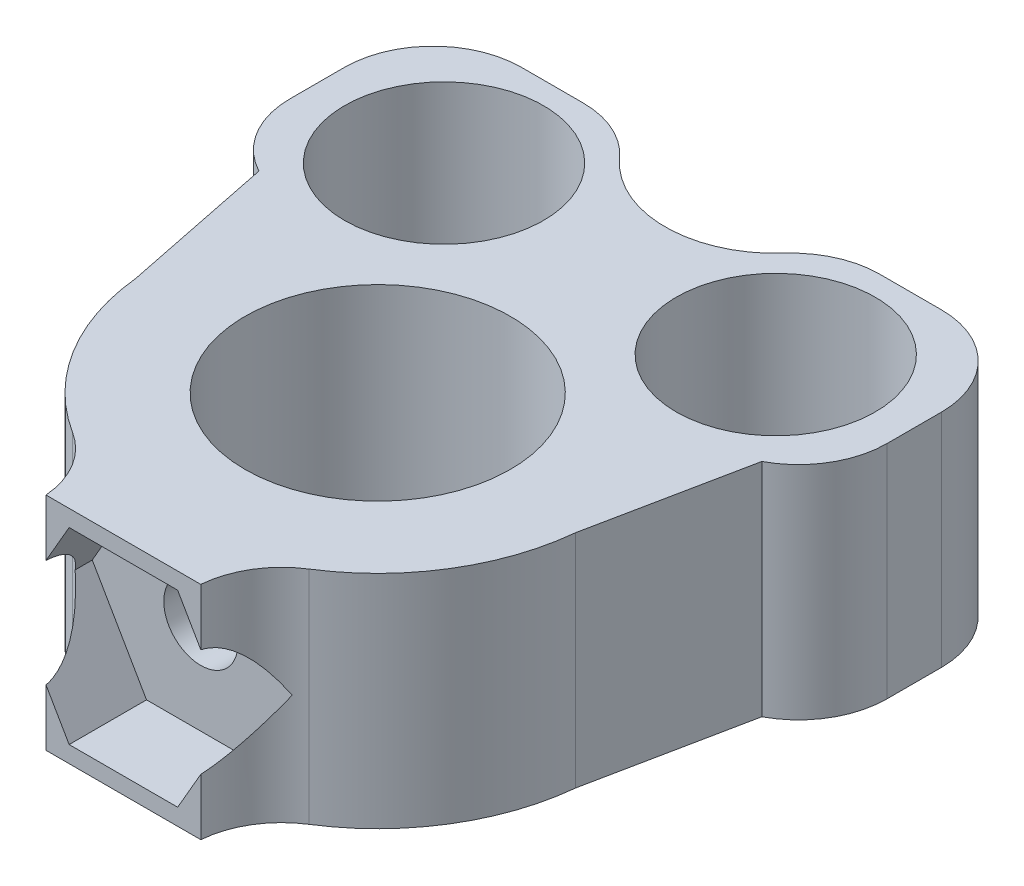
ISO-10303-21;
HEADER;
FILE_DESCRIPTION(('STEP AP214'),'2;1');
FILE_NAME('part.step','',(''),(''),'','','');
FILE_SCHEMA(('AUTOMOTIVE_DESIGN { 1 0 10303 214 1 1 1 1 }'));
ENDSEC;
DATA;
#1=APPLICATION_CONTEXT('core data for automotive mechanical design processes');
#2=APPLICATION_PROTOCOL_DEFINITION('international standard','automotive_design',2000,#1);
#3=PRODUCT_CONTEXT('',#1,'mechanical');
#4=PRODUCT('Part','Part','',(#3));
#5=PRODUCT_RELATED_PRODUCT_CATEGORY('part','',(#4));
#6=PRODUCT_DEFINITION_FORMATION('','',#4);
#7=PRODUCT_DEFINITION_CONTEXT('part definition',#1,'design');
#8=PRODUCT_DEFINITION('design','',#6,#7);
#9=PRODUCT_DEFINITION_SHAPE('','',#8);
#10=(LENGTH_UNIT() NAMED_UNIT(*) SI_UNIT(.MILLI.,.METRE.));
#11=(NAMED_UNIT(*) PLANE_ANGLE_UNIT() SI_UNIT($,.RADIAN.));
#12=(NAMED_UNIT(*) SI_UNIT($,.STERADIAN.) SOLID_ANGLE_UNIT());
#13=UNCERTAINTY_MEASURE_WITH_UNIT(LENGTH_MEASURE(1.E-05),#10,'distance_accuracy_value','');
#14=(GEOMETRIC_REPRESENTATION_CONTEXT(3) GLOBAL_UNCERTAINTY_ASSIGNED_CONTEXT((#13)) GLOBAL_UNIT_ASSIGNED_CONTEXT((#10,
#11,#12)) REPRESENTATION_CONTEXT('',''));
#15=CARTESIAN_POINT('',(0.,0.,0.));
#16=DIRECTION('',(0.,0.,1.));
#17=DIRECTION('',(1.,0.,0.));
#18=AXIS2_PLACEMENT_3D('',#15,#16,#17);
#19=CARTESIAN_POINT('',(-3.5,17.6157731058639,11.5));
#20=DIRECTION('',(0.,0.,-1.));
#21=DIRECTION('',(-1.,0.,0.));
#22=AXIS2_PLACEMENT_3D('',#19,#20,#21);
#23=PLANE('',#22);
#24=DIRECTION('',(0.,-1.,0.));
#25=VECTOR('',#24,1.);
#26=CARTESIAN_POINT('',(3.5,17.6157731058639,11.5));
#27=LINE('',#26,#25);
#28=CARTESIAN_POINT('',(3.5,2.56217782649107,11.5));
#29=VERTEX_POINT('',#28);
#30=CARTESIAN_POINT('',(3.5,0.,11.5));
#31=VERTEX_POINT('',#30);
#32=EDGE_CURVE('E276',#29,#31,#27,.T.);
#33=ORIENTED_EDGE('',*,*,#32,.F.);
#34=DIRECTION('',(0.5,0.866025403784439,0.));
#35=VECTOR('',#34,1.);
#36=CARTESIAN_POINT('',(2.45373864405591,0.749999999999999,11.5));
#37=LINE('',#36,#35);
#38=CARTESIAN_POINT('',(2.45373864405591,0.749999999999999,11.5));
#39=VERTEX_POINT('',#38);
#40=EDGE_CURVE('E248',#39,#29,#37,.T.);
#41=ORIENTED_EDGE('',*,*,#40,.F.);
#42=DIRECTION('',(1.,0.,0.));
#43=VECTOR('',#42,1.);
#44=CARTESIAN_POINT('',(-2.45373864405591,0.75,11.5));
#45=LINE('',#44,#43);
#46=CARTESIAN_POINT('',(-2.45373864405591,0.75,11.5));
#47=VERTEX_POINT('',#46);
#48=EDGE_CURVE('E235',#47,#39,#45,.T.);
#49=ORIENTED_EDGE('',*,*,#48,.F.);
#50=DIRECTION('',(0.5,-0.866025403784439,0.));
#51=VECTOR('',#50,1.);
#52=CARTESIAN_POINT('',(-4.90747728811182,5.,11.5));
#53=LINE('',#52,#51);
#54=CARTESIAN_POINT('',(-3.5,2.56217782649107,11.5));
#55=VERTEX_POINT('',#54);
#56=EDGE_CURVE('E238',#55,#47,#53,.T.);
#57=ORIENTED_EDGE('',*,*,#56,.F.);
#58=DIRECTION('',(0.,-1.,0.));
#59=VECTOR('',#58,1.);
#60=CARTESIAN_POINT('',(-3.5,17.6157731058639,11.5));
#61=LINE('',#60,#59);
#62=CARTESIAN_POINT('',(-3.5,0.,11.5));
#63=VERTEX_POINT('',#62);
#64=EDGE_CURVE('E355',#55,#63,#61,.T.);
#65=ORIENTED_EDGE('',*,*,#64,.T.);
#66=DIRECTION('',(1.,0.,0.));
#67=VECTOR('',#66,1.);
#68=CARTESIAN_POINT('',(-3.5,0.,11.5));
#69=LINE('',#68,#67);
#70=EDGE_CURVE('E277',#63,#31,#69,.T.);
#71=ORIENTED_EDGE('',*,*,#70,.T.);
#72=EDGE_LOOP('',(#33,#41,#49,#57,#65,#71));
#73=FACE_BOUND('',#72,.T.);
#74=ADVANCED_FACE('F37',(#73),#23,.F.);
#75=CARTESIAN_POINT('',(0.,5.,1.5));
#76=DIRECTION('',(0.,0.,1.));
#77=DIRECTION('',(1.,0.,0.));
#78=AXIS2_PLACEMENT_3D('',#75,#76,#77);
#79=CYLINDRICAL_SURFACE('',#78,1.675);
#80=CARTESIAN_POINT('',(1.675,5.,5.76145597917749));
#81=CARTESIAN_POINT('',(1.67499813287039,4.90790372306215,5.76145739046166));
#82=CARTESIAN_POINT('',(1.66737855764244,4.81578829290095,5.76368835662663));
#83=CARTESIAN_POINT('',(1.63716675301543,4.63422962014335,5.77234130192067));
#84=CARTESIAN_POINT('',(1.6145679402135,4.54478757057462,5.77876512379866));
#85=CARTESIAN_POINT('',(1.55520802415418,4.37122887277344,5.79502078922855));
#86=CARTESIAN_POINT('',(1.51846813881969,4.28710446482321,5.80484752468551));
#87=CARTESIAN_POINT('',(1.43193673503308,4.12619736566288,5.82679514004935));
#88=CARTESIAN_POINT('',(1.38214385190091,4.04941544324975,5.83891625979534));
#89=CARTESIAN_POINT('',(1.26945999140456,3.90326872173409,5.86445926362132));
#90=CARTESIAN_POINT('',(1.20627494913284,3.83413494000583,5.87790594225534));
#91=CARTESIAN_POINT('',(1.06923199775077,3.70729471628609,5.90437177192418));
#92=CARTESIAN_POINT('',(0.995372892153938,3.64958955708298,5.91739087482976));
#93=CARTESIAN_POINT('',(0.837461437101782,3.5462669106183,5.9418131423305));
#94=CARTESIAN_POINT('',(0.753251929263998,3.50088122484796,5.95318365968228));
#95=CARTESIAN_POINT('',(0.578026161618626,3.42500123569182,5.97274182438189));
#96=CARTESIAN_POINT('',(0.487011168007824,3.39450417010972,5.98093006206144));
#97=CARTESIAN_POINT('',(0.303171467813839,3.35002088286354,5.99302571511142));
#98=CARTESIAN_POINT('',(0.210448789463982,3.3356411839928,5.99703497314064));
#99=CARTESIAN_POINT('',(0.0238261874268686,3.32256061197843,6.00067794381072));
#100=CARTESIAN_POINT('',(-0.0700735179249902,3.32385687275306,6.00031245629929));
#101=CARTESIAN_POINT('',(-0.25363814483196,3.34181902168141,5.99532078768024));
#102=CARTESIAN_POINT('',(-0.343348400806763,3.35805945132849,5.99081255480385));
#103=CARTESIAN_POINT('',(-0.518715700520692,3.40475882911559,5.97818261967571));
#104=CARTESIAN_POINT('',(-0.604372502372109,3.43521862461322,5.97006070207935));
#105=CARTESIAN_POINT('',(-0.77026029118548,3.50980418461912,5.95094536294966));
#106=CARTESIAN_POINT('',(-0.850424165784499,3.55407133977516,5.93992242562329));
#107=CARTESIAN_POINT('',(-1.00232760711901,3.65490539453904,5.91618616332203));
#108=CARTESIAN_POINT('',(-1.07406539309102,3.71147488693652,5.90347248223275));
#109=CARTESIAN_POINT('',(-1.20962033134318,3.83754801286481,5.87722296079586));
#110=CARTESIAN_POINT('',(-1.27309092189677,3.90742196677234,5.86367384774196));
#111=CARTESIAN_POINT('',(-1.38750286201445,4.05696001477119,5.83766114959023));
#112=CARTESIAN_POINT('',(-1.438443288192,4.13662482973296,5.82519764453789));
#113=CARTESIAN_POINT('',(-1.52664710801133,4.30429230674782,5.80271012915392));
#114=CARTESIAN_POINT('',(-1.56380767008233,4.39235172633889,5.79270464123621));
#115=CARTESIAN_POINT('',(-1.62267894505091,4.57381895759274,5.77649166082482));
#116=CARTESIAN_POINT('',(-1.64439391718776,4.66722528712178,5.77028312135989));
#117=CARTESIAN_POINT('',(-1.671142119666,4.85347269347323,5.76259253501128));
#118=CARTESIAN_POINT('',(-1.67669590311014,4.94623299917178,5.76096305754204));
#119=CARTESIAN_POINT('',(-1.67240539939881,5.13135866287216,5.76221013673988));
#120=CARTESIAN_POINT('',(-1.66256293229457,5.2237240662627,5.76508616079399));
#121=CARTESIAN_POINT('',(-1.62822002807531,5.40337347250912,5.77487692451402));
#122=CARTESIAN_POINT('',(-1.60404047022031,5.49072411605855,5.78170317578325));
#123=CARTESIAN_POINT('',(-1.54207458280703,5.66012777447521,5.79853689433599));
#124=CARTESIAN_POINT('',(-1.50428635362314,5.74218004785969,5.80854480572251));
#125=CARTESIAN_POINT('',(-1.41514442224651,5.90081372850195,5.83091071141389));
#126=CARTESIAN_POINT('',(-1.36348941563666,5.97721857023209,5.84331894507179));
#127=CARTESIAN_POINT('',(-1.2484479413425,6.12046664079486,5.8689730271058));
#128=CARTESIAN_POINT('',(-1.18505904931687,6.18730788862168,5.88221904820441));
#129=CARTESIAN_POINT('',(-1.04592689192099,6.31173397312628,5.90856998791621));
#130=CARTESIAN_POINT('',(-0.969852830365259,6.36895356112807,5.92165678361054));
#131=CARTESIAN_POINT('',(-0.808880746812239,6.46981498555978,5.94578215088506));
#132=CARTESIAN_POINT('',(-0.723983191871376,6.51345754017873,5.95682083079267));
#133=CARTESIAN_POINT('',(-0.548367966797927,6.58551375763772,5.97553531197357));
#134=CARTESIAN_POINT('',(-0.457700370905419,6.61404255627146,5.9832364540199));
#135=CARTESIAN_POINT('',(-0.272608408622516,6.65538385963051,5.99451997584414));
#136=CARTESIAN_POINT('',(-0.178184967105391,6.66820020909607,5.998103363198));
#137=CARTESIAN_POINT('',(0.00834005508443473,6.67749294405844,6.00069501379819));
#138=CARTESIAN_POINT('',(0.100413343589052,6.6745027516735,5.99985263886584));
#139=CARTESIAN_POINT('',(0.282693155894818,6.65351909472699,5.99403036082604));
#140=CARTESIAN_POINT('',(0.372899761944648,6.63552629265039,5.98905064041546));
#141=CARTESIAN_POINT('',(0.548179020904459,6.58536091296349,5.97554773415595));
#142=CARTESIAN_POINT('',(0.633287672861283,6.55330568520326,5.96705390596423));
#143=CARTESIAN_POINT('',(0.796966434661624,6.4760297516374,5.94740676969569));
#144=CARTESIAN_POINT('',(0.875535561234675,6.43080707058048,5.93625306265556));
#145=CARTESIAN_POINT('',(1.02635056825304,6.32697026945424,5.91207315433919));
#146=CARTESIAN_POINT('',(1.09835041134348,6.2680092204532,5.89900241747154));
#147=CARTESIAN_POINT('',(1.2316138799385,6.13901516719194,5.87262730855817));
#148=CARTESIAN_POINT('',(1.29287458256055,6.0689791584837,5.85932287398737));
#149=CARTESIAN_POINT('',(1.40442993479674,5.91774013676656,5.83360450448941));
#150=CARTESIAN_POINT('',(1.45441577295136,5.83630371025036,5.82122074546479));
#151=CARTESIAN_POINT('',(1.53991927898694,5.66584728370423,5.79919050442271));
#152=CARTESIAN_POINT('',(1.5754455333395,5.57683182238916,5.78954239893974));
#153=CARTESIAN_POINT('',(1.62688671004406,5.40691343192677,5.7752786586563));
#154=CARTESIAN_POINT('',(1.6448842870352,5.32667937195142,5.77013954195346));
#155=CARTESIAN_POINT('',(1.66894092172763,5.16430177465612,5.76322781046103));
#156=CARTESIAN_POINT('',(1.67500166565456,5.08215850869418,5.76145472017977));
#157=CARTESIAN_POINT('',(1.675,5.,5.76145597917749));
#158=B_SPLINE_CURVE_WITH_KNOTS('',3,(#80,#81,#82,#83,#84,#85,#86,#87,#88,#89,#90,#91,#92,#93,
#94,#95,#96,#97,#98,#99,#100,#101,#102,#103,#104,#105,#106,#107,#108,#109,#110,#111,#112,#113,
#114,#115,#116,#117,#118,#119,#120,#121,#122,#123,#124,#125,#126,#127,#128,#129,#130,#131,#132,
#133,#134,#135,#136,#137,#138,#139,#140,#141,#142,#143,#144,#145,#146,#147,#148,#149,#150,#151,
#152,#153,#154,#155,#156,#157),.UNSPECIFIED.,.T.,.F.,(4,2,2,2,2,2,2,2,2,2,2,2,2,2,2,2,2,2,2,2,2,
2,2,2,2,2,2,2,2,2,2,2,2,2,2,2,2,2,4),(0.,0.275986386089451,0.552094149209319,0.827789232319853,
1.10351315062562,1.38607130702987,1.66866116079315,1.95624827994125,2.24378202448351,
2.52413190012598,2.80443051935243,3.07698800724941,3.34956173941142,3.62502378677538,
3.90054394573898,4.18530945541263,4.47009594405381,4.75696679695311,5.0437585123251,
5.32120445994149,5.59861761206166,5.8700446175412,6.14150952603592,6.41943186023543,
6.69741168026666,6.9842991358467,7.27117141326032,7.5558256903888,7.84041030044462,
8.11545367006386,8.39048489496605,8.66326341269745,8.93608287106827,9.21672830840476,
9.49745001109611,9.78511708191507,10.0726130785418,10.3188535826098,10.5650592996586),.UNSPECIFIED.);
#159=CARTESIAN_POINT('',(1.675,5.,5.76145597917749));
#160=VERTEX_POINT('',#159);
#161=EDGE_CURVE('E269',#160,#160,#158,.T.);
#162=ORIENTED_EDGE('',*,*,#161,.T.);
#163=EDGE_LOOP('',(#162));
#164=FACE_BOUND('',#163,.T.);
#165=CARTESIAN_POINT('',(0.,5.,8.));
#166=DIRECTION('',(0.,0.,1.));
#167=DIRECTION('',(1.,0.,0.));
#168=AXIS2_PLACEMENT_3D('',#165,#166,#167);
#169=CIRCLE('',#168,1.675);
#170=CARTESIAN_POINT('',(1.675,5.,8.));
#171=VERTEX_POINT('',#170);
#172=EDGE_CURVE('E41',#171,#171,#169,.F.);
#173=ORIENTED_EDGE('',*,*,#172,.F.);
#174=EDGE_LOOP('',(#173));
#175=FACE_BOUND('',#174,.T.);
#176=ADVANCED_FACE('F283',(#164,#175),#79,.F.);
#177=CARTESIAN_POINT('',(0.,10.,0.));
#178=DIRECTION('',(0.,-1.,0.));
#179=DIRECTION('',(0.,0.,-1.));
#180=AXIS2_PLACEMENT_3D('',#177,#178,#179);
#181=CYLINDRICAL_SURFACE('',#180,10.);
#182=CARTESIAN_POINT('',(0.,10.,0.));
#183=DIRECTION('',(0.,1.,0.));
#184=DIRECTION('',(0.,0.,1.));
#185=AXIS2_PLACEMENT_3D('',#182,#183,#184);
#186=CIRCLE('',#185,10.);
#187=CARTESIAN_POINT('',(5.34738866227727,10.,8.45017363694667));
#188=VERTEX_POINT('',#187);
#189=CARTESIAN_POINT('',(9.9498743710662,10.,0.999999999999996));
#190=VERTEX_POINT('',#189);
#191=EDGE_CURVE('E384',#188,#190,#186,.T.);
#192=ORIENTED_EDGE('',*,*,#191,.F.);
#193=DIRECTION('',(0.,-1.,0.));
#194=VECTOR('',#193,1.);
#195=CARTESIAN_POINT('',(5.34738866227727,10.,8.45017363694667));
#196=LINE('',#195,#194);
#197=CARTESIAN_POINT('',(5.34738866227727,0.,8.45017363694667));
#198=VERTEX_POINT('',#197);
#199=EDGE_CURVE('E476',#188,#198,#196,.T.);
#200=ORIENTED_EDGE('',*,*,#199,.T.);
#201=CARTESIAN_POINT('',(0.,0.,0.));
#202=DIRECTION('',(0.,1.,0.));
#203=DIRECTION('',(0.,0.,1.));
#204=AXIS2_PLACEMENT_3D('',#201,#202,#203);
#205=CIRCLE('',#204,10.);
#206=CARTESIAN_POINT('',(9.9498743710662,0.,0.999999999999996));
#207=VERTEX_POINT('',#206);
#208=EDGE_CURVE('E405',#198,#207,#205,.T.);
#209=ORIENTED_EDGE('',*,*,#208,.T.);
#210=DIRECTION('',(0.,-1.,0.));
#211=VECTOR('',#210,1.);
#212=CARTESIAN_POINT('',(9.9498743710662,10.,0.999999999999996));
#213=LINE('',#212,#211);
#214=EDGE_CURVE('E394',#207,#190,#213,.F.);
#215=ORIENTED_EDGE('',*,*,#214,.T.);
#216=EDGE_LOOP('',(#192,#200,#209,#215));
#217=FACE_BOUND('',#216,.T.);
#218=ADVANCED_FACE('F288',(#217),#181,.T.);
#219=CARTESIAN_POINT('',(-9.9498743710662,0.,0.999999999999996));
#220=VERTEX_POINT('',#219);
#221=CARTESIAN_POINT('',(-5.34738866227727,0.,8.45017363694667));
#222=VERTEX_POINT('',#221);
#223=EDGE_CURVE('E406',#220,#222,#205,.T.);
#224=ORIENTED_EDGE('',*,*,#223,.T.);
#225=DIRECTION('',(0.,-1.,0.));
#226=VECTOR('',#225,1.);
#227=CARTESIAN_POINT('',(-5.34738866227727,10.,8.45017363694667));
#228=LINE('',#227,#226);
#229=CARTESIAN_POINT('',(-5.34738866227727,10.,8.45017363694667));
#230=VERTEX_POINT('',#229);
#231=EDGE_CURVE('E474',#222,#230,#228,.F.);
#232=ORIENTED_EDGE('',*,*,#231,.T.);
#233=CARTESIAN_POINT('',(-9.9498743710662,10.,0.999999999999996));
#234=VERTEX_POINT('',#233);
#235=EDGE_CURVE('E385',#234,#230,#186,.T.);
#236=ORIENTED_EDGE('',*,*,#235,.F.);
#237=DIRECTION('',(0.,-1.,0.));
#238=VECTOR('',#237,1.);
#239=CARTESIAN_POINT('',(-9.9498743710662,10.,0.999999999999996));
#240=LINE('',#239,#238);
#241=EDGE_CURVE('E416',#234,#220,#240,.T.);
#242=ORIENTED_EDGE('',*,*,#241,.T.);
#243=EDGE_LOOP('',(#224,#232,#236,#242));
#244=FACE_BOUND('',#243,.T.);
#245=ADVANCED_FACE('F325',(#244),#181,.T.);
#246=CARTESIAN_POINT('',(0.,10.,-18.));
#247=DIRECTION('',(0.,-1.,0.));
#248=DIRECTION('',(0.,0.,-1.));
#249=AXIS2_PLACEMENT_3D('',#246,#247,#248);
#250=CYLINDRICAL_SURFACE('',#249,5.);
#251=CARTESIAN_POINT('',(0.,10.,-18.));
#252=DIRECTION('',(0.,1.,0.));
#253=DIRECTION('',(0.,0.,1.));
#254=AXIS2_PLACEMENT_3D('',#251,#252,#253);
#255=CIRCLE('',#254,5.);
#256=CARTESIAN_POINT('',(-3.72677996249965,10.,-14.6666666666667));
#257=VERTEX_POINT('',#256);
#258=CARTESIAN_POINT('',(3.72677996249965,10.,-14.6666666666667));
#259=VERTEX_POINT('',#258);
#260=EDGE_CURVE('E376',#257,#259,#255,.T.);
#261=ORIENTED_EDGE('',*,*,#260,.T.);
#262=DIRECTION('',(0.,-1.,0.));
#263=VECTOR('',#262,1.);
#264=CARTESIAN_POINT('',(3.72677996249965,10.,-14.6666666666667));
#265=LINE('',#264,#263);
#266=CARTESIAN_POINT('',(3.72677996249965,0.,-14.6666666666667));
#267=VERTEX_POINT('',#266);
#268=EDGE_CURVE('E437',#259,#267,#265,.T.);
#269=ORIENTED_EDGE('',*,*,#268,.T.);
#270=CARTESIAN_POINT('',(0.,0.,-18.));
#271=DIRECTION('',(0.,1.,0.));
#272=DIRECTION('',(0.,0.,1.));
#273=AXIS2_PLACEMENT_3D('',#270,#271,#272);
#274=CIRCLE('',#273,5.);
#275=CARTESIAN_POINT('',(-3.72677996249965,0.,-14.6666666666667));
#276=VERTEX_POINT('',#275);
#277=EDGE_CURVE('E397',#276,#267,#274,.T.);
#278=ORIENTED_EDGE('',*,*,#277,.F.);
#279=DIRECTION('',(0.,-1.,0.));
#280=VECTOR('',#279,1.);
#281=CARTESIAN_POINT('',(-3.72677996249965,10.,-14.6666666666667));
#282=LINE('',#281,#280);
#283=EDGE_CURVE('E435',#276,#257,#282,.F.);
#284=ORIENTED_EDGE('',*,*,#283,.T.);
#285=EDGE_LOOP('',(#261,#269,#278,#284));
#286=FACE_BOUND('',#285,.T.);
#287=ADVANCED_FACE('F331',(#286),#250,.F.);
#288=CARTESIAN_POINT('',(0.,10.,-16.));
#289=DIRECTION('',(0.,0.,-1.));
#290=DIRECTION('',(-1.,0.,0.));
#291=AXIS2_PLACEMENT_3D('',#288,#289,#290);
#292=PLANE('',#291);
#293=DIRECTION('',(1.,0.,0.));
#294=VECTOR('',#293,1.);
#295=CARTESIAN_POINT('',(0.,10.,-16.));
#296=LINE('',#295,#294);
#297=CARTESIAN_POINT('',(-9.5,10.,-16.));
#298=VERTEX_POINT('',#297);
#299=CARTESIAN_POINT('',(-6.70820393249937,10.,-16.));
#300=VERTEX_POINT('',#299);
#301=EDGE_CURVE('E379',#298,#300,#296,.T.);
#302=ORIENTED_EDGE('',*,*,#301,.T.);
#303=DIRECTION('',(0.,-1.,0.));
#304=VECTOR('',#303,1.);
#305=CARTESIAN_POINT('',(-6.70820393249937,10.,-16.));
#306=LINE('',#305,#304);
#307=CARTESIAN_POINT('',(-6.70820393249937,0.,-16.));
#308=VERTEX_POINT('',#307);
#309=EDGE_CURVE('E471',#300,#308,#306,.T.);
#310=ORIENTED_EDGE('',*,*,#309,.T.);
#311=DIRECTION('',(1.,0.,0.));
#312=VECTOR('',#311,1.);
#313=CARTESIAN_POINT('',(0.,0.,-16.));
#314=LINE('',#313,#312);
#315=CARTESIAN_POINT('',(-9.5,0.,-16.));
#316=VERTEX_POINT('',#315);
#317=EDGE_CURVE('E400',#316,#308,#314,.T.);
#318=ORIENTED_EDGE('',*,*,#317,.F.);
#319=DIRECTION('',(0.,-1.,0.));
#320=VECTOR('',#319,1.);
#321=CARTESIAN_POINT('',(-9.5,10.,-16.));
#322=LINE('',#321,#320);
#323=EDGE_CURVE('E469',#316,#298,#322,.F.);
#324=ORIENTED_EDGE('',*,*,#323,.T.);
#325=EDGE_LOOP('',(#302,#310,#318,#324));
#326=FACE_BOUND('',#325,.T.);
#327=ADVANCED_FACE('F329',(#326),#292,.T.);
#328=CARTESIAN_POINT('',(-13.5,10.,0.));
#329=DIRECTION('',(1.,0.,0.));
#330=DIRECTION('',(0.,0.,-1.));
#331=AXIS2_PLACEMENT_3D('',#328,#329,#330);
#332=PLANE('',#331);
#333=DIRECTION('',(0.,0.,1.));
#334=VECTOR('',#333,1.);
#335=CARTESIAN_POINT('',(-13.5,0.,0.));
#336=LINE('',#335,#334);
#337=CARTESIAN_POINT('',(-13.5,0.,-12.));
#338=VERTEX_POINT('',#337);
#339=CARTESIAN_POINT('',(-13.5,0.,-9.53529241585479));
#340=VERTEX_POINT('',#339);
#341=EDGE_CURVE('E403',#338,#340,#336,.T.);
#342=ORIENTED_EDGE('',*,*,#341,.T.);
#343=DIRECTION('',(0.,-1.,0.));
#344=VECTOR('',#343,1.);
#345=CARTESIAN_POINT('',(-13.5,10.,-9.53529241585479));
#346=LINE('',#345,#344);
#347=CARTESIAN_POINT('',(-13.5,10.,-9.53529241585479));
#348=VERTEX_POINT('',#347);
#349=EDGE_CURVE('E61',#340,#348,#346,.F.);
#350=ORIENTED_EDGE('',*,*,#349,.T.);
#351=DIRECTION('',(0.,0.,1.));
#352=VECTOR('',#351,1.);
#353=CARTESIAN_POINT('',(-13.5,10.,0.));
#354=LINE('',#353,#352);
#355=CARTESIAN_POINT('',(-13.5,10.,-12.));
#356=VERTEX_POINT('',#355);
#357=EDGE_CURVE('E382',#356,#348,#354,.T.);
#358=ORIENTED_EDGE('',*,*,#357,.F.);
#359=DIRECTION('',(0.,-1.,0.));
#360=VECTOR('',#359,1.);
#361=CARTESIAN_POINT('',(-13.5,0.,-12.));
#362=LINE('',#361,#360);
#363=EDGE_CURVE('E483',#356,#338,#362,.T.);
#364=ORIENTED_EDGE('',*,*,#363,.T.);
#365=EDGE_LOOP('',(#342,#350,#358,#364));
#366=FACE_BOUND('',#365,.T.);
#367=ADVANCED_FACE('F321',(#366),#332,.F.);
#368=CARTESIAN_POINT('',(13.5,10.,0.));
#369=DIRECTION('',(1.,0.,0.));
#370=DIRECTION('',(0.,0.,-1.));
#371=AXIS2_PLACEMENT_3D('',#368,#369,#370);
#372=PLANE('',#371);
#373=DIRECTION('',(0.,0.,1.));
#374=VECTOR('',#373,1.);
#375=CARTESIAN_POINT('',(13.5,0.,0.));
#376=LINE('',#375,#374);
#377=CARTESIAN_POINT('',(13.5,0.,-12.));
#378=VERTEX_POINT('',#377);
#379=CARTESIAN_POINT('',(13.5,0.,-9.53529241585479));
#380=VERTEX_POINT('',#379);
#381=EDGE_CURVE('E409',#378,#380,#376,.T.);
#382=ORIENTED_EDGE('',*,*,#381,.F.);
#383=DIRECTION('',(0.,-1.,0.));
#384=VECTOR('',#383,1.);
#385=CARTESIAN_POINT('',(13.5,10.,-12.));
#386=LINE('',#385,#384);
#387=CARTESIAN_POINT('',(13.5,10.,-12.));
#388=VERTEX_POINT('',#387);
#389=EDGE_CURVE('E481',#378,#388,#386,.F.);
#390=ORIENTED_EDGE('',*,*,#389,.T.);
#391=DIRECTION('',(0.,0.,1.));
#392=VECTOR('',#391,1.);
#393=CARTESIAN_POINT('',(13.5,10.,0.));
#394=LINE('',#393,#392);
#395=CARTESIAN_POINT('',(13.5,10.,-9.53529241585479));
#396=VERTEX_POINT('',#395);
#397=EDGE_CURVE('E388',#388,#396,#394,.T.);
#398=ORIENTED_EDGE('',*,*,#397,.T.);
#399=DIRECTION('',(0.,-1.,0.));
#400=VECTOR('',#399,1.);
#401=CARTESIAN_POINT('',(13.5,0.,-9.53529241585479));
#402=LINE('',#401,#400);
#403=EDGE_CURVE('E478',#396,#380,#402,.T.);
#404=ORIENTED_EDGE('',*,*,#403,.T.);
#405=EDGE_LOOP('',(#382,#390,#398,#404));
#406=FACE_BOUND('',#405,.T.);
#407=ADVANCED_FACE('F318',(#406),#372,.T.);
#408=CARTESIAN_POINT('',(0.,10.,0.));
#409=DIRECTION('',(0.,-1.,0.));
#410=DIRECTION('',(0.,0.,-1.));
#411=AXIS2_PLACEMENT_3D('',#408,#409,#410);
#412=CYLINDRICAL_SURFACE('',#411,6.);
#413=ORIENTED_EDGE('',*,*,#161,.F.);
#414=EDGE_LOOP('',(#413));
#415=FACE_BOUND('',#414,.T.);
#416=CARTESIAN_POINT('',(0.,10.,0.));
#417=DIRECTION('',(0.,1.,0.));
#418=DIRECTION('',(0.,0.,1.));
#419=AXIS2_PLACEMENT_3D('',#416,#417,#418);
#420=CIRCLE('',#419,6.);
#421=CARTESIAN_POINT('',(0.,10.,6.));
#422=VERTEX_POINT('',#421);
#423=EDGE_CURVE('E373',#422,#422,#420,.T.);
#424=ORIENTED_EDGE('',*,*,#423,.T.);
#425=EDGE_LOOP('',(#424));
#426=FACE_BOUND('',#425,.T.);
#427=CARTESIAN_POINT('',(0.,0.,0.));
#428=DIRECTION('',(0.,1.,0.));
#429=DIRECTION('',(0.,0.,1.));
#430=AXIS2_PLACEMENT_3D('',#427,#428,#429);
#431=CIRCLE('',#430,6.);
#432=CARTESIAN_POINT('',(0.,0.,6.));
#433=VERTEX_POINT('',#432);
#434=EDGE_CURVE('E370',#433,#433,#431,.T.);
#435=ORIENTED_EDGE('',*,*,#434,.F.);
#436=EDGE_LOOP('',(#435));
#437=FACE_BOUND('',#436,.T.);
#438=ADVANCED_FACE('F279',(#415,#426,#437),#412,.F.);
#439=CARTESIAN_POINT('',(0.,10.,-16.));
#440=DIRECTION('',(0.,0.,-1.));
#441=DIRECTION('',(-1.,0.,0.));
#442=AXIS2_PLACEMENT_3D('',#439,#440,#441);
#443=PLANE('',#442);
#444=DIRECTION('',(1.,0.,0.));
#445=VECTOR('',#444,1.);
#446=CARTESIAN_POINT('',(0.,0.,-16.));
#447=LINE('',#446,#445);
#448=CARTESIAN_POINT('',(6.70820393249938,0.,-16.));
#449=VERTEX_POINT('',#448);
#450=CARTESIAN_POINT('',(9.50000000000001,0.,-16.));
#451=VERTEX_POINT('',#450);
#452=EDGE_CURVE('E377',#449,#451,#447,.T.);
#453=ORIENTED_EDGE('',*,*,#452,.F.);
#454=DIRECTION('',(0.,-1.,0.));
#455=VECTOR('',#454,1.);
#456=CARTESIAN_POINT('',(6.70820393249938,10.,-16.));
#457=LINE('',#456,#455);
#458=CARTESIAN_POINT('',(6.70820393249938,10.,-16.));
#459=VERTEX_POINT('',#458);
#460=EDGE_CURVE('E455',#449,#459,#457,.F.);
#461=ORIENTED_EDGE('',*,*,#460,.T.);
#462=DIRECTION('',(1.,0.,0.));
#463=VECTOR('',#462,1.);
#464=CARTESIAN_POINT('',(0.,10.,-16.));
#465=LINE('',#464,#463);
#466=CARTESIAN_POINT('',(9.50000000000001,10.,-16.));
#467=VERTEX_POINT('',#466);
#468=EDGE_CURVE('E391',#459,#467,#465,.T.);
#469=ORIENTED_EDGE('',*,*,#468,.T.);
#470=DIRECTION('',(0.,-1.,0.));
#471=VECTOR('',#470,1.);
#472=CARTESIAN_POINT('',(9.50000000000001,10.,-16.));
#473=LINE('',#472,#471);
#474=EDGE_CURVE('E452',#467,#451,#473,.T.);
#475=ORIENTED_EDGE('',*,*,#474,.T.);
#476=EDGE_LOOP('',(#453,#461,#469,#475));
#477=FACE_BOUND('',#476,.T.);
#478=ADVANCED_FACE('F310',(#477),#443,.T.);
#479=CARTESIAN_POINT('',(0.,10.,0.));
#480=DIRECTION('',(0.,1.,0.));
#481=DIRECTION('',(0.,0.,1.));
#482=AXIS2_PLACEMENT_3D('',#479,#480,#481);
#483=PLANE('',#482);
#484=ORIENTED_EDGE('',*,*,#468,.F.);
#485=CARTESIAN_POINT('',(6.70820393249937,10.,-12.));
#486=DIRECTION('',(0.,1.,0.));
#487=DIRECTION('',(0.,0.,1.));
#488=AXIS2_PLACEMENT_3D('',#485,#486,#487);
#489=CIRCLE('',#488,4.);
#490=EDGE_CURVE('E467',#459,#259,#489,.T.);
#491=ORIENTED_EDGE('',*,*,#490,.T.);
#492=ORIENTED_EDGE('',*,*,#260,.F.);
#493=CARTESIAN_POINT('',(-6.70820393249937,10.,-12.));
#494=DIRECTION('',(0.,1.,0.));
#495=DIRECTION('',(0.,0.,1.));
#496=AXIS2_PLACEMENT_3D('',#493,#494,#495);
#497=CIRCLE('',#496,4.);
#498=EDGE_CURVE('E465',#257,#300,#497,.T.);
#499=ORIENTED_EDGE('',*,*,#498,.T.);
#500=ORIENTED_EDGE('',*,*,#301,.F.);
#501=CARTESIAN_POINT('',(-9.5,10.,-12.));
#502=DIRECTION('',(0.,1.,0.));
#503=DIRECTION('',(0.,0.,1.));
#504=AXIS2_PLACEMENT_3D('',#501,#502,#503);
#505=CIRCLE('',#504,4.);
#506=EDGE_CURVE('E457',#298,#356,#505,.T.);
#507=ORIENTED_EDGE('',*,*,#506,.T.);
#508=ORIENTED_EDGE('',*,*,#357,.T.);
#509=CARTESIAN_POINT('',(-9.5,10.,-9.53529241585479));
#510=DIRECTION('',(0.,1.,0.));
#511=DIRECTION('',(0.,0.,1.));
#512=AXIS2_PLACEMENT_3D('',#509,#510,#511);
#513=CIRCLE('',#512,4.);
#514=CARTESIAN_POINT('',(-11.3712849955043,10.,-6.));
#515=VERTEX_POINT('',#514);
#516=EDGE_CURVE('E459',#348,#515,#513,.T.);
#517=ORIENTED_EDGE('',*,*,#516,.T.);
#518=DIRECTION('',(0.198997487421337,0.,0.979999999999997));
#519=VECTOR('',#518,1.);
#520=CARTESIAN_POINT('',(-9.9498743710662,10.,0.99999999999999));
#521=LINE('',#520,#519);
#522=EDGE_CURVE('E428',#515,#234,#521,.T.);
#523=ORIENTED_EDGE('',*,*,#522,.T.);
#524=ORIENTED_EDGE('',*,*,#235,.T.);
#525=CARTESIAN_POINT('',(-7.48634412718818,10.,11.8302430917253));
#526=DIRECTION('',(0.,1.,0.));
#527=DIRECTION('',(0.,0.,1.));
#528=AXIS2_PLACEMENT_3D('',#525,#526,#527);
#529=CIRCLE('',#528,4.);
#530=CARTESIAN_POINT('',(-3.5,10.,11.5));
#531=VERTEX_POINT('',#530);
#532=EDGE_CURVE('E489',#230,#531,#529,.F.);
#533=ORIENTED_EDGE('',*,*,#532,.T.);
#534=DIRECTION('',(1.,0.,0.));
#535=VECTOR('',#534,1.);
#536=CARTESIAN_POINT('',(-3.5,10.,11.5));
#537=LINE('',#536,#535);
#538=CARTESIAN_POINT('',(3.5,10.,11.5));
#539=VERTEX_POINT('',#538);
#540=EDGE_CURVE('E366',#531,#539,#537,.T.);
#541=ORIENTED_EDGE('',*,*,#540,.T.);
#542=CARTESIAN_POINT('',(7.48634412718818,10.,11.8302430917253));
#543=DIRECTION('',(0.,1.,0.));
#544=DIRECTION('',(0.,0.,1.));
#545=AXIS2_PLACEMENT_3D('',#542,#543,#544);
#546=CIRCLE('',#545,4.);
#547=EDGE_CURVE('E491',#539,#188,#546,.F.);
#548=ORIENTED_EDGE('',*,*,#547,.T.);
#549=ORIENTED_EDGE('',*,*,#191,.T.);
#550=DIRECTION('',(0.198997487421337,0.,-0.979999999999997));
#551=VECTOR('',#550,1.);
#552=CARTESIAN_POINT('',(11.3712849955043,10.,-6.));
#553=LINE('',#552,#551);
#554=CARTESIAN_POINT('',(11.3712849955043,10.,-6.));
#555=VERTEX_POINT('',#554);
#556=EDGE_CURVE('E433',#190,#555,#553,.T.);
#557=ORIENTED_EDGE('',*,*,#556,.T.);
#558=CARTESIAN_POINT('',(9.5,10.,-9.53529241585479));
#559=DIRECTION('',(0.,1.,0.));
#560=DIRECTION('',(0.,0.,1.));
#561=AXIS2_PLACEMENT_3D('',#558,#559,#560);
#562=CIRCLE('',#561,4.);
#563=EDGE_CURVE('E461',#555,#396,#562,.T.);
#564=ORIENTED_EDGE('',*,*,#563,.T.);
#565=ORIENTED_EDGE('',*,*,#397,.F.);
#566=CARTESIAN_POINT('',(9.5,10.,-12.));
#567=DIRECTION('',(0.,1.,0.));
#568=DIRECTION('',(0.,0.,1.));
#569=AXIS2_PLACEMENT_3D('',#566,#567,#568);
#570=CIRCLE('',#569,4.);
#571=EDGE_CURVE('E463',#388,#467,#570,.T.);
#572=ORIENTED_EDGE('',*,*,#571,.T.);
#573=EDGE_LOOP('',(#484,#491,#492,#499,#500,#507,#508,#517,#523,#524,#533,#541,#548,#549,#557,
#564,#565,#572));
#574=FACE_BOUND('',#573,.T.);
#575=CARTESIAN_POINT('',(7.5,10.,-10.5));
#576=DIRECTION('',(0.,1.,0.));
#577=DIRECTION('',(0.,0.,1.));
#578=AXIS2_PLACEMENT_3D('',#575,#576,#577);
#579=CIRCLE('',#578,4.5);
#580=CARTESIAN_POINT('',(7.5,10.,-6.));
#581=VERTEX_POINT('',#580);
#582=EDGE_CURVE('E363',#581,#581,#579,.T.);
#583=ORIENTED_EDGE('',*,*,#582,.F.);
#584=EDGE_LOOP('',(#583));
#585=FACE_BOUND('',#584,.T.);
#586=CARTESIAN_POINT('',(-7.5,10.,-10.5));
#587=DIRECTION('',(0.,1.,0.));
#588=DIRECTION('',(0.,0.,1.));
#589=AXIS2_PLACEMENT_3D('',#586,#587,#588);
#590=CIRCLE('',#589,4.5);
#591=CARTESIAN_POINT('',(-7.5,10.,-6.));
#592=VERTEX_POINT('',#591);
#593=EDGE_CURVE('E362',#592,#592,#590,.T.);
#594=ORIENTED_EDGE('',*,*,#593,.F.);
#595=EDGE_LOOP('',(#594));
#596=FACE_BOUND('',#595,.T.);
#597=ORIENTED_EDGE('',*,*,#423,.F.);
#598=EDGE_LOOP('',(#597));
#599=FACE_BOUND('',#598,.T.);
#600=ADVANCED_FACE('F307',(#574,#585,#596,#599),#483,.T.);
#601=CARTESIAN_POINT('',(0.,0.,0.));
#602=DIRECTION('',(0.,1.,0.));
#603=DIRECTION('',(0.,0.,1.));
#604=AXIS2_PLACEMENT_3D('',#601,#602,#603);
#605=PLANE('',#604);
#606=ORIENTED_EDGE('',*,*,#277,.T.);
#607=CARTESIAN_POINT('',(6.70820393249937,0.,-12.));
#608=DIRECTION('',(0.,1.,0.));
#609=DIRECTION('',(0.,0.,1.));
#610=AXIS2_PLACEMENT_3D('',#607,#608,#609);
#611=CIRCLE('',#610,4.);
#612=EDGE_CURVE('E450',#267,#449,#611,.F.);
#613=ORIENTED_EDGE('',*,*,#612,.T.);
#614=ORIENTED_EDGE('',*,*,#452,.T.);
#615=CARTESIAN_POINT('',(9.5,0.,-12.));
#616=DIRECTION('',(0.,1.,0.));
#617=DIRECTION('',(0.,0.,1.));
#618=AXIS2_PLACEMENT_3D('',#615,#616,#617);
#619=CIRCLE('',#618,4.);
#620=EDGE_CURVE('E446',#451,#378,#619,.F.);
#621=ORIENTED_EDGE('',*,*,#620,.T.);
#622=ORIENTED_EDGE('',*,*,#381,.T.);
#623=CARTESIAN_POINT('',(9.5,0.,-9.53529241585479));
#624=DIRECTION('',(0.,1.,0.));
#625=DIRECTION('',(0.,0.,1.));
#626=AXIS2_PLACEMENT_3D('',#623,#624,#625);
#627=CIRCLE('',#626,4.);
#628=CARTESIAN_POINT('',(11.3712849955043,0.,-6.));
#629=VERTEX_POINT('',#628);
#630=EDGE_CURVE('E444',#380,#629,#627,.F.);
#631=ORIENTED_EDGE('',*,*,#630,.T.);
#632=DIRECTION('',(-0.198997487421337,0.,0.979999999999997));
#633=VECTOR('',#632,1.);
#634=CARTESIAN_POINT('',(9.75087688364484,0.,1.98000000000013));
#635=LINE('',#634,#633);
#636=EDGE_CURVE('E430',#629,#207,#635,.T.);
#637=ORIENTED_EDGE('',*,*,#636,.T.);
#638=ORIENTED_EDGE('',*,*,#208,.F.);
#639=CARTESIAN_POINT('',(7.48634412718818,0.,11.8302430917253));
#640=DIRECTION('',(0.,1.,0.));
#641=DIRECTION('',(0.,0.,1.));
#642=AXIS2_PLACEMENT_3D('',#639,#640,#641);
#643=CIRCLE('',#642,4.);
#644=EDGE_CURVE('E493',#198,#31,#643,.T.);
#645=ORIENTED_EDGE('',*,*,#644,.T.);
#646=ORIENTED_EDGE('',*,*,#70,.F.);
#647=CARTESIAN_POINT('',(-7.48634412718818,0.,11.8302430917253));
#648=DIRECTION('',(0.,1.,0.));
#649=DIRECTION('',(0.,0.,1.));
#650=AXIS2_PLACEMENT_3D('',#647,#648,#649);
#651=CIRCLE('',#650,4.);
#652=EDGE_CURVE('E487',#63,#222,#651,.T.);
#653=ORIENTED_EDGE('',*,*,#652,.T.);
#654=ORIENTED_EDGE('',*,*,#223,.F.);
#655=DIRECTION('',(-0.198997487421337,0.,-0.979999999999997));
#656=VECTOR('',#655,1.);
#657=CARTESIAN_POINT('',(-9.75087688364484,0.,1.98000000000013));
#658=LINE('',#657,#656);
#659=CARTESIAN_POINT('',(-11.3712849955043,0.,-6.));
#660=VERTEX_POINT('',#659);
#661=EDGE_CURVE('E425',#220,#660,#658,.T.);
#662=ORIENTED_EDGE('',*,*,#661,.T.);
#663=CARTESIAN_POINT('',(-9.5,0.,-9.53529241585479));
#664=DIRECTION('',(0.,1.,0.));
#665=DIRECTION('',(0.,0.,1.));
#666=AXIS2_PLACEMENT_3D('',#663,#664,#665);
#667=CIRCLE('',#666,4.);
#668=EDGE_CURVE('E442',#660,#340,#667,.F.);
#669=ORIENTED_EDGE('',*,*,#668,.T.);
#670=ORIENTED_EDGE('',*,*,#341,.F.);
#671=CARTESIAN_POINT('',(-9.5,0.,-12.));
#672=DIRECTION('',(0.,1.,0.));
#673=DIRECTION('',(0.,0.,1.));
#674=AXIS2_PLACEMENT_3D('',#671,#672,#673);
#675=CIRCLE('',#674,4.);
#676=EDGE_CURVE('E440',#338,#316,#675,.F.);
#677=ORIENTED_EDGE('',*,*,#676,.T.);
#678=ORIENTED_EDGE('',*,*,#317,.T.);
#679=CARTESIAN_POINT('',(-6.70820393249937,0.,-12.));
#680=DIRECTION('',(0.,1.,0.));
#681=DIRECTION('',(0.,0.,1.));
#682=AXIS2_PLACEMENT_3D('',#679,#680,#681);
#683=CIRCLE('',#682,4.);
#684=EDGE_CURVE('E448',#308,#276,#683,.F.);
#685=ORIENTED_EDGE('',*,*,#684,.T.);
#686=EDGE_LOOP('',(#606,#613,#614,#621,#622,#631,#637,#638,#645,#646,#653,#654,#662,#669,#670,
#677,#678,#685));
#687=FACE_BOUND('',#686,.T.);
#688=ORIENTED_EDGE('',*,*,#434,.T.);
#689=EDGE_LOOP('',(#688));
#690=FACE_BOUND('',#689,.T.);
#691=CARTESIAN_POINT('',(-7.5,0.,-10.5));
#692=DIRECTION('',(0.,1.,0.));
#693=DIRECTION('',(0.,0.,1.));
#694=AXIS2_PLACEMENT_3D('',#691,#692,#693);
#695=CIRCLE('',#694,4.5);
#696=CARTESIAN_POINT('',(-7.5,0.,-6.));
#697=VERTEX_POINT('',#696);
#698=EDGE_CURVE('E367',#697,#697,#695,.T.);
#699=ORIENTED_EDGE('',*,*,#698,.T.);
#700=EDGE_LOOP('',(#699));
#701=FACE_BOUND('',#700,.T.);
#702=CARTESIAN_POINT('',(7.5,0.,-10.5));
#703=DIRECTION('',(0.,1.,0.));
#704=DIRECTION('',(0.,0.,1.));
#705=AXIS2_PLACEMENT_3D('',#702,#703,#704);
#706=CIRCLE('',#705,4.5);
#707=CARTESIAN_POINT('',(7.5,0.,-6.));
#708=VERTEX_POINT('',#707);
#709=EDGE_CURVE('E359',#708,#708,#706,.T.);
#710=ORIENTED_EDGE('',*,*,#709,.T.);
#711=EDGE_LOOP('',(#710));
#712=FACE_BOUND('',#711,.T.);
#713=ADVANCED_FACE('F305',(#687,#690,#701,#712),#605,.F.);
#714=CARTESIAN_POINT('',(-7.5,0.,-10.5));
#715=DIRECTION('',(0.,1.,0.));
#716=DIRECTION('',(0.,0.,1.));
#717=AXIS2_PLACEMENT_3D('',#714,#715,#716);
#718=CYLINDRICAL_SURFACE('',#717,4.5);
#719=ORIENTED_EDGE('',*,*,#698,.F.);
#720=EDGE_LOOP('',(#719));
#721=FACE_BOUND('',#720,.T.);
#722=ORIENTED_EDGE('',*,*,#593,.T.);
#723=EDGE_LOOP('',(#722));
#724=FACE_BOUND('',#723,.T.);
#725=ADVANCED_FACE('F301',(#721,#724),#718,.F.);
#726=CARTESIAN_POINT('',(7.5,0.,-10.5));
#727=DIRECTION('',(0.,1.,0.));
#728=DIRECTION('',(0.,0.,1.));
#729=AXIS2_PLACEMENT_3D('',#726,#727,#728);
#730=CYLINDRICAL_SURFACE('',#729,4.5);
#731=ORIENTED_EDGE('',*,*,#709,.F.);
#732=EDGE_LOOP('',(#731));
#733=FACE_BOUND('',#732,.T.);
#734=ORIENTED_EDGE('',*,*,#582,.T.);
#735=EDGE_LOOP('',(#734));
#736=FACE_BOUND('',#735,.T.);
#737=ADVANCED_FACE('F297',(#733,#736),#730,.F.);
#738=CARTESIAN_POINT('',(-9.9498743710662,10.,0.99999999999999));
#739=DIRECTION('',(0.979999999999997,0.,-0.198997487421337));
#740=DIRECTION('',(0.,-1.,0.));
#741=AXIS2_PLACEMENT_3D('',#738,#739,#740);
#742=PLANE('',#741);
#743=ORIENTED_EDGE('',*,*,#522,.F.);
#744=DIRECTION('',(0.,1.,0.));
#745=VECTOR('',#744,1.);
#746=CARTESIAN_POINT('',(-11.3712849955043,10.,-6.));
#747=LINE('',#746,#745);
#748=EDGE_CURVE('E419',#660,#515,#747,.T.);
#749=ORIENTED_EDGE('',*,*,#748,.F.);
#750=ORIENTED_EDGE('',*,*,#661,.F.);
#751=ORIENTED_EDGE('',*,*,#241,.F.);
#752=EDGE_LOOP('',(#743,#749,#750,#751));
#753=FACE_BOUND('',#752,.T.);
#754=ADVANCED_FACE('F300',(#753),#742,.F.);
#755=CARTESIAN_POINT('',(11.3712849955043,10.,-6.));
#756=DIRECTION('',(-0.979999999999997,0.,-0.198997487421337));
#757=DIRECTION('',(0.,-1.,0.));
#758=AXIS2_PLACEMENT_3D('',#755,#756,#757);
#759=PLANE('',#758);
#760=ORIENTED_EDGE('',*,*,#556,.F.);
#761=ORIENTED_EDGE('',*,*,#214,.F.);
#762=ORIENTED_EDGE('',*,*,#636,.F.);
#763=DIRECTION('',(0.,-1.,0.));
#764=VECTOR('',#763,1.);
#765=CARTESIAN_POINT('',(11.3712849955043,0.,-6.));
#766=LINE('',#765,#764);
#767=EDGE_CURVE('E422',#555,#629,#766,.T.);
#768=ORIENTED_EDGE('',*,*,#767,.F.);
#769=EDGE_LOOP('',(#760,#761,#762,#768));
#770=FACE_BOUND('',#769,.T.);
#771=ADVANCED_FACE('F295',(#770),#759,.F.);
#772=CARTESIAN_POINT('',(-3.5,7.43782217350892,11.5));
#773=VERTEX_POINT('',#772);
#774=EDGE_CURVE('E358',#531,#773,#61,.T.);
#775=ORIENTED_EDGE('',*,*,#774,.T.);
#776=DIRECTION('',(-0.5,-0.866025403784439,0.));
#777=VECTOR('',#776,1.);
#778=CARTESIAN_POINT('',(-2.45373864405591,9.25,11.5));
#779=LINE('',#778,#777);
#780=CARTESIAN_POINT('',(-2.45373864405591,9.25,11.5));
#781=VERTEX_POINT('',#780);
#782=EDGE_CURVE('E255',#781,#773,#779,.T.);
#783=ORIENTED_EDGE('',*,*,#782,.F.);
#784=DIRECTION('',(-1.,0.,0.));
#785=VECTOR('',#784,1.);
#786=CARTESIAN_POINT('',(2.45373864405591,9.25,11.5));
#787=LINE('',#786,#785);
#788=CARTESIAN_POINT('',(2.45373864405591,9.25,11.5));
#789=VERTEX_POINT('',#788);
#790=EDGE_CURVE('E252',#789,#781,#787,.T.);
#791=ORIENTED_EDGE('',*,*,#790,.F.);
#792=DIRECTION('',(-0.5,0.866025403784439,0.));
#793=VECTOR('',#792,1.);
#794=CARTESIAN_POINT('',(4.90747728811182,5.,11.5));
#795=LINE('',#794,#793);
#796=CARTESIAN_POINT('',(3.5,7.43782217350893,11.5));
#797=VERTEX_POINT('',#796);
#798=EDGE_CURVE('E250',#797,#789,#795,.T.);
#799=ORIENTED_EDGE('',*,*,#798,.F.);
#800=EDGE_CURVE('E352',#539,#797,#27,.T.);
#801=ORIENTED_EDGE('',*,*,#800,.F.);
#802=ORIENTED_EDGE('',*,*,#540,.F.);
#803=EDGE_LOOP('',(#775,#783,#791,#799,#801,#802));
#804=FACE_BOUND('',#803,.T.);
#805=ADVANCED_FACE('F291',(#804),#23,.F.);
#806=CARTESIAN_POINT('',(6.70820393249937,10.,-12.));
#807=DIRECTION('',(0.,-1.,0.));
#808=DIRECTION('',(0.,0.,-1.));
#809=AXIS2_PLACEMENT_3D('',#806,#807,#808);
#810=CYLINDRICAL_SURFACE('',#809,4.);
#811=ORIENTED_EDGE('',*,*,#490,.F.);
#812=ORIENTED_EDGE('',*,*,#460,.F.);
#813=ORIENTED_EDGE('',*,*,#612,.F.);
#814=ORIENTED_EDGE('',*,*,#268,.F.);
#815=EDGE_LOOP('',(#811,#812,#813,#814));
#816=FACE_BOUND('',#815,.T.);
#817=ADVANCED_FACE('F294',(#816),#810,.T.);
#818=CARTESIAN_POINT('',(-6.70820393249937,10.,-12.));
#819=DIRECTION('',(0.,-1.,0.));
#820=DIRECTION('',(0.,0.,-1.));
#821=AXIS2_PLACEMENT_3D('',#818,#819,#820);
#822=CYLINDRICAL_SURFACE('',#821,4.);
#823=ORIENTED_EDGE('',*,*,#498,.F.);
#824=ORIENTED_EDGE('',*,*,#283,.F.);
#825=ORIENTED_EDGE('',*,*,#684,.F.);
#826=ORIENTED_EDGE('',*,*,#309,.F.);
#827=EDGE_LOOP('',(#823,#824,#825,#826));
#828=FACE_BOUND('',#827,.T.);
#829=ADVANCED_FACE('F543',(#828),#822,.T.);
#830=CARTESIAN_POINT('',(-7.48634412718818,10.,11.8302430917253));
#831=DIRECTION('',(0.,1.,0.));
#832=DIRECTION('',(0.,0.,1.));
#833=AXIS2_PLACEMENT_3D('',#830,#831,#832);
#834=CYLINDRICAL_SURFACE('',#833,4.);
#835=ORIENTED_EDGE('',*,*,#64,.F.);
#836=CARTESIAN_POINT('',(-7.48634412718818,9.46672839123481,11.8302430917253));
#837=DIRECTION('',(-0.866025403784439,-0.5,0.));
#838=DIRECTION('',(-0.5,0.866025403784439,0.));
#839=AXIS2_PLACEMENT_3D('',#836,#837,#838);
#840=ELLIPSE('',#839,8.,4.);
#841=CARTESIAN_POINT('',(-4.90747728811182,5.,8.77255673987165));
#842=VERTEX_POINT('',#841);
#843=EDGE_CURVE('E11',#55,#842,#840,.F.);
#844=ORIENTED_EDGE('',*,*,#843,.T.);
#845=CARTESIAN_POINT('',(-7.48634412718818,0.533271608765184,11.8302430917253));
#846=DIRECTION('',(-0.866025403784439,0.5,0.));
#847=DIRECTION('',(0.5,0.866025403784439,0.));
#848=AXIS2_PLACEMENT_3D('',#845,#846,#847);
#849=ELLIPSE('',#848,8.,4.);
#850=EDGE_CURVE('E46',#842,#773,#849,.F.);
#851=ORIENTED_EDGE('',*,*,#850,.T.);
#852=ORIENTED_EDGE('',*,*,#774,.F.);
#853=ORIENTED_EDGE('',*,*,#532,.F.);
#854=ORIENTED_EDGE('',*,*,#231,.F.);
#855=ORIENTED_EDGE('',*,*,#652,.F.);
#856=EDGE_LOOP('',(#835,#844,#851,#852,#853,#854,#855));
#857=FACE_BOUND('',#856,.T.);
#858=ADVANCED_FACE('F503',(#857),#834,.F.);
#859=CARTESIAN_POINT('',(7.48634412718818,10.,11.8302430917253));
#860=DIRECTION('',(0.,-1.,0.));
#861=DIRECTION('',(0.,0.,-1.));
#862=AXIS2_PLACEMENT_3D('',#859,#860,#861);
#863=CYLINDRICAL_SURFACE('',#862,4.);
#864=CARTESIAN_POINT('',(7.48634412718818,0.533271608765188,11.8302430917253));
#865=DIRECTION('',(0.866025403784439,0.5,0.));
#866=DIRECTION('',(0.5,-0.866025403784439,0.));
#867=AXIS2_PLACEMENT_3D('',#864,#865,#866);
#868=ELLIPSE('',#867,8.00000000000001,4.);
#869=CARTESIAN_POINT('',(4.90747728811182,5.,8.77255673987165));
#870=VERTEX_POINT('',#869);
#871=EDGE_CURVE('E495',#797,#870,#868,.F.);
#872=ORIENTED_EDGE('',*,*,#871,.T.);
#873=CARTESIAN_POINT('',(7.48634412718818,9.46672839123481,11.8302430917253));
#874=DIRECTION('',(0.866025403784439,-0.5,0.));
#875=DIRECTION('',(-0.5,-0.866025403784439,0.));
#876=AXIS2_PLACEMENT_3D('',#873,#874,#875);
#877=ELLIPSE('',#876,8.,4.);
#878=EDGE_CURVE('E217',#870,#29,#877,.F.);
#879=ORIENTED_EDGE('',*,*,#878,.T.);
#880=ORIENTED_EDGE('',*,*,#32,.T.);
#881=ORIENTED_EDGE('',*,*,#644,.F.);
#882=ORIENTED_EDGE('',*,*,#199,.F.);
#883=ORIENTED_EDGE('',*,*,#547,.F.);
#884=ORIENTED_EDGE('',*,*,#800,.T.);
#885=EDGE_LOOP('',(#872,#879,#880,#881,#882,#883,#884));
#886=FACE_BOUND('',#885,.T.);
#887=ADVANCED_FACE('F518',(#886),#863,.F.);
#888=CARTESIAN_POINT('',(9.5,10.,-12.));
#889=DIRECTION('',(0.,-1.,0.));
#890=DIRECTION('',(0.,0.,-1.));
#891=AXIS2_PLACEMENT_3D('',#888,#889,#890);
#892=CYLINDRICAL_SURFACE('',#891,4.);
#893=ORIENTED_EDGE('',*,*,#571,.F.);
#894=ORIENTED_EDGE('',*,*,#389,.F.);
#895=ORIENTED_EDGE('',*,*,#620,.F.);
#896=ORIENTED_EDGE('',*,*,#474,.F.);
#897=EDGE_LOOP('',(#893,#894,#895,#896));
#898=FACE_BOUND('',#897,.T.);
#899=ADVANCED_FACE('F555',(#898),#892,.T.);
#900=CARTESIAN_POINT('',(9.5,10.,-9.53529241585479));
#901=DIRECTION('',(0.,1.,0.));
#902=DIRECTION('',(0.,0.,1.));
#903=AXIS2_PLACEMENT_3D('',#900,#901,#902);
#904=CYLINDRICAL_SURFACE('',#903,4.);
#905=ORIENTED_EDGE('',*,*,#563,.F.);
#906=ORIENTED_EDGE('',*,*,#767,.T.);
#907=ORIENTED_EDGE('',*,*,#630,.F.);
#908=ORIENTED_EDGE('',*,*,#403,.F.);
#909=EDGE_LOOP('',(#905,#906,#907,#908));
#910=FACE_BOUND('',#909,.T.);
#911=ADVANCED_FACE('F562',(#910),#904,.T.);
#912=CARTESIAN_POINT('',(-9.5,10.,-9.53529241585479));
#913=DIRECTION('',(0.,-1.,0.));
#914=DIRECTION('',(0.,0.,-1.));
#915=AXIS2_PLACEMENT_3D('',#912,#913,#914);
#916=CYLINDRICAL_SURFACE('',#915,4.);
#917=ORIENTED_EDGE('',*,*,#516,.F.);
#918=ORIENTED_EDGE('',*,*,#349,.F.);
#919=ORIENTED_EDGE('',*,*,#668,.F.);
#920=ORIENTED_EDGE('',*,*,#748,.T.);
#921=EDGE_LOOP('',(#917,#918,#919,#920));
#922=FACE_BOUND('',#921,.T.);
#923=ADVANCED_FACE('F534',(#922),#916,.T.);
#924=CARTESIAN_POINT('',(-9.5,10.,-12.));
#925=DIRECTION('',(0.,1.,0.));
#926=DIRECTION('',(0.,0.,1.));
#927=AXIS2_PLACEMENT_3D('',#924,#925,#926);
#928=CYLINDRICAL_SURFACE('',#927,4.);
#929=ORIENTED_EDGE('',*,*,#506,.F.);
#930=ORIENTED_EDGE('',*,*,#323,.F.);
#931=ORIENTED_EDGE('',*,*,#676,.F.);
#932=ORIENTED_EDGE('',*,*,#363,.F.);
#933=EDGE_LOOP('',(#929,#930,#931,#932));
#934=FACE_BOUND('',#933,.T.);
#935=ADVANCED_FACE('F39',(#934),#928,.T.);
#936=CARTESIAN_POINT('',(0.,0.,8.));
#937=DIRECTION('',(0.,0.,1.));
#938=DIRECTION('',(1.,0.,0.));
#939=AXIS2_PLACEMENT_3D('',#936,#937,#938);
#940=PLANE('',#939);
#941=DIRECTION('',(0.5,0.866025403784439,0.));
#942=VECTOR('',#941,1.);
#943=CARTESIAN_POINT('',(2.45373864405591,0.749999999999999,8.));
#944=LINE('',#943,#942);
#945=CARTESIAN_POINT('',(2.45373864405591,0.749999999999999,8.));
#946=VERTEX_POINT('',#945);
#947=CARTESIAN_POINT('',(4.90747728811182,5.,8.));
#948=VERTEX_POINT('',#947);
#949=EDGE_CURVE('E214',#946,#948,#944,.T.);
#950=ORIENTED_EDGE('',*,*,#949,.T.);
#951=DIRECTION('',(-0.5,0.866025403784439,0.));
#952=VECTOR('',#951,1.);
#953=CARTESIAN_POINT('',(4.90747728811182,5.,8.));
#954=LINE('',#953,#952);
#955=CARTESIAN_POINT('',(2.45373864405591,9.25,8.));
#956=VERTEX_POINT('',#955);
#957=EDGE_CURVE('E223',#948,#956,#954,.T.);
#958=ORIENTED_EDGE('',*,*,#957,.T.);
#959=DIRECTION('',(-1.,0.,0.));
#960=VECTOR('',#959,1.);
#961=CARTESIAN_POINT('',(2.45373864405591,9.25,8.));
#962=LINE('',#961,#960);
#963=CARTESIAN_POINT('',(-2.45373864405591,9.25,8.));
#964=VERTEX_POINT('',#963);
#965=EDGE_CURVE('E229',#956,#964,#962,.T.);
#966=ORIENTED_EDGE('',*,*,#965,.T.);
#967=DIRECTION('',(-0.5,-0.866025403784439,0.));
#968=VECTOR('',#967,1.);
#969=CARTESIAN_POINT('',(-2.45373864405591,9.25,8.));
#970=LINE('',#969,#968);
#971=CARTESIAN_POINT('',(-4.90747728811182,5.,8.));
#972=VERTEX_POINT('',#971);
#973=EDGE_CURVE('E242',#964,#972,#970,.T.);
#974=ORIENTED_EDGE('',*,*,#973,.T.);
#975=DIRECTION('',(0.5,-0.866025403784439,0.));
#976=VECTOR('',#975,1.);
#977=CARTESIAN_POINT('',(-4.90747728811182,5.,8.));
#978=LINE('',#977,#976);
#979=CARTESIAN_POINT('',(-2.45373864405591,0.75,8.));
#980=VERTEX_POINT('',#979);
#981=EDGE_CURVE('E245',#972,#980,#978,.T.);
#982=ORIENTED_EDGE('',*,*,#981,.T.);
#983=DIRECTION('',(1.,0.,0.));
#984=VECTOR('',#983,1.);
#985=CARTESIAN_POINT('',(-2.45373864405591,0.75,8.));
#986=LINE('',#985,#984);
#987=EDGE_CURVE('E220',#980,#946,#986,.T.);
#988=ORIENTED_EDGE('',*,*,#987,.T.);
#989=EDGE_LOOP('',(#950,#958,#966,#974,#982,#988));
#990=FACE_BOUND('',#989,.T.);
#991=ORIENTED_EDGE('',*,*,#172,.T.);
#992=EDGE_LOOP('',(#991));
#993=FACE_BOUND('',#992,.T.);
#994=ADVANCED_FACE('F231',(#990,#993),#940,.T.);
#995=CARTESIAN_POINT('',(-4.90747728811182,5.,8.));
#996=DIRECTION('',(-0.866025403784439,-0.5,0.));
#997=DIRECTION('',(0.5,-0.866025403784439,0.));
#998=AXIS2_PLACEMENT_3D('',#995,#996,#997);
#999=PLANE('',#998);
#1000=ORIENTED_EDGE('',*,*,#56,.T.);
#1001=DIRECTION('',(0.,0.,1.));
#1002=VECTOR('',#1001,1.);
#1003=CARTESIAN_POINT('',(-2.45373864405591,0.75,8.));
#1004=LINE('',#1003,#1002);
#1005=EDGE_CURVE('E260',#980,#47,#1004,.T.);
#1006=ORIENTED_EDGE('',*,*,#1005,.F.);
#1007=ORIENTED_EDGE('',*,*,#981,.F.);
#1008=DIRECTION('',(0.,0.,1.));
#1009=VECTOR('',#1008,1.);
#1010=CARTESIAN_POINT('',(-4.90747728811182,5.,8.));
#1011=LINE('',#1010,#1009);
#1012=EDGE_CURVE('E263',#972,#842,#1011,.T.);
#1013=ORIENTED_EDGE('',*,*,#1012,.T.);
#1014=ORIENTED_EDGE('',*,*,#843,.F.);
#1015=EDGE_LOOP('',(#1000,#1006,#1007,#1013,#1014));
#1016=FACE_BOUND('',#1015,.T.);
#1017=ADVANCED_FACE('F589',(#1016),#999,.F.);
#1018=CARTESIAN_POINT('',(-2.45373864405591,9.25,8.));
#1019=DIRECTION('',(-0.866025403784439,0.5,0.));
#1020=DIRECTION('',(-0.5,-0.866025403784439,0.));
#1021=AXIS2_PLACEMENT_3D('',#1018,#1019,#1020);
#1022=PLANE('',#1021);
#1023=ORIENTED_EDGE('',*,*,#1012,.F.);
#1024=ORIENTED_EDGE('',*,*,#973,.F.);
#1025=DIRECTION('',(0.,0.,1.));
#1026=VECTOR('',#1025,1.);
#1027=CARTESIAN_POINT('',(-2.45373864405591,9.25,8.));
#1028=LINE('',#1027,#1026);
#1029=EDGE_CURVE('E266',#964,#781,#1028,.T.);
#1030=ORIENTED_EDGE('',*,*,#1029,.T.);
#1031=ORIENTED_EDGE('',*,*,#782,.T.);
#1032=ORIENTED_EDGE('',*,*,#850,.F.);
#1033=EDGE_LOOP('',(#1023,#1024,#1030,#1031,#1032));
#1034=FACE_BOUND('',#1033,.T.);
#1035=ADVANCED_FACE('F594',(#1034),#1022,.F.);
#1036=CARTESIAN_POINT('',(2.45373864405591,0.749999999999999,8.));
#1037=DIRECTION('',(0.866025403784439,-0.5,0.));
#1038=DIRECTION('',(0.5,0.866025403784439,0.));
#1039=AXIS2_PLACEMENT_3D('',#1036,#1037,#1038);
#1040=PLANE('',#1039);
#1041=DIRECTION('',(0.,0.,1.));
#1042=VECTOR('',#1041,1.);
#1043=CARTESIAN_POINT('',(4.90747728811182,5.,8.));
#1044=LINE('',#1043,#1042);
#1045=EDGE_CURVE('E53',#948,#870,#1044,.T.);
#1046=ORIENTED_EDGE('',*,*,#1045,.F.);
#1047=ORIENTED_EDGE('',*,*,#949,.F.);
#1048=DIRECTION('',(0.,0.,1.));
#1049=VECTOR('',#1048,1.);
#1050=CARTESIAN_POINT('',(2.45373864405591,0.749999999999999,8.));
#1051=LINE('',#1050,#1049);
#1052=EDGE_CURVE('E258',#946,#39,#1051,.T.);
#1053=ORIENTED_EDGE('',*,*,#1052,.T.);
#1054=ORIENTED_EDGE('',*,*,#40,.T.);
#1055=ORIENTED_EDGE('',*,*,#878,.F.);
#1056=EDGE_LOOP('',(#1046,#1047,#1053,#1054,#1055));
#1057=FACE_BOUND('',#1056,.T.);
#1058=ADVANCED_FACE('F212',(#1057),#1040,.F.);
#1059=CARTESIAN_POINT('',(4.90747728811182,5.,8.));
#1060=DIRECTION('',(0.866025403784439,0.5,0.));
#1061=DIRECTION('',(-0.5,0.866025403784439,0.));
#1062=AXIS2_PLACEMENT_3D('',#1059,#1060,#1061);
#1063=PLANE('',#1062);
#1064=ORIENTED_EDGE('',*,*,#798,.T.);
#1065=DIRECTION('',(0.,0.,1.));
#1066=VECTOR('',#1065,1.);
#1067=CARTESIAN_POINT('',(2.45373864405591,9.25,8.));
#1068=LINE('',#1067,#1066);
#1069=EDGE_CURVE('E219',#956,#789,#1068,.T.);
#1070=ORIENTED_EDGE('',*,*,#1069,.F.);
#1071=ORIENTED_EDGE('',*,*,#957,.F.);
#1072=ORIENTED_EDGE('',*,*,#1045,.T.);
#1073=ORIENTED_EDGE('',*,*,#871,.F.);
#1074=EDGE_LOOP('',(#1064,#1070,#1071,#1072,#1073));
#1075=FACE_BOUND('',#1074,.T.);
#1076=ADVANCED_FACE('F224',(#1075),#1063,.F.);
#1077=CARTESIAN_POINT('',(-2.45373864405591,0.75,8.));
#1078=DIRECTION('',(0.,-1.,0.));
#1079=DIRECTION('',(1.,0.,0.));
#1080=AXIS2_PLACEMENT_3D('',#1077,#1078,#1079);
#1081=PLANE('',#1080);
#1082=ORIENTED_EDGE('',*,*,#48,.T.);
#1083=ORIENTED_EDGE('',*,*,#1052,.F.);
#1084=ORIENTED_EDGE('',*,*,#987,.F.);
#1085=ORIENTED_EDGE('',*,*,#1005,.T.);
#1086=EDGE_LOOP('',(#1082,#1083,#1084,#1085));
#1087=FACE_BOUND('',#1086,.T.);
#1088=ADVANCED_FACE('F598',(#1087),#1081,.F.);
#1089=CARTESIAN_POINT('',(2.45373864405591,9.25,8.));
#1090=DIRECTION('',(0.,1.,0.));
#1091=DIRECTION('',(0.,0.,1.));
#1092=AXIS2_PLACEMENT_3D('',#1089,#1090,#1091);
#1093=PLANE('',#1092);
#1094=ORIENTED_EDGE('',*,*,#790,.T.);
#1095=ORIENTED_EDGE('',*,*,#1029,.F.);
#1096=ORIENTED_EDGE('',*,*,#965,.F.);
#1097=ORIENTED_EDGE('',*,*,#1069,.T.);
#1098=EDGE_LOOP('',(#1094,#1095,#1096,#1097));
#1099=FACE_BOUND('',#1098,.T.);
#1100=ADVANCED_FACE('F600',(#1099),#1093,.F.);
#1101=CLOSED_SHELL('',(#74,#176,#218,#245,#287,#327,#367,#407,#438,#478,#600,#713,#725,#737,
#754,#771,#805,#817,#829,#858,#887,#899,#911,#923,#935,#994,#1017,#1035,#1058,#1076,#1088,#1100));
#1102=MANIFOLD_SOLID_BREP('B2',#1101);
#1103=ADVANCED_BREP_SHAPE_REPRESENTATION('',(#18,#1102),#14);
#1104=SHAPE_DEFINITION_REPRESENTATION(#9,#1103);
ENDSEC;
END-ISO-10303-21;
